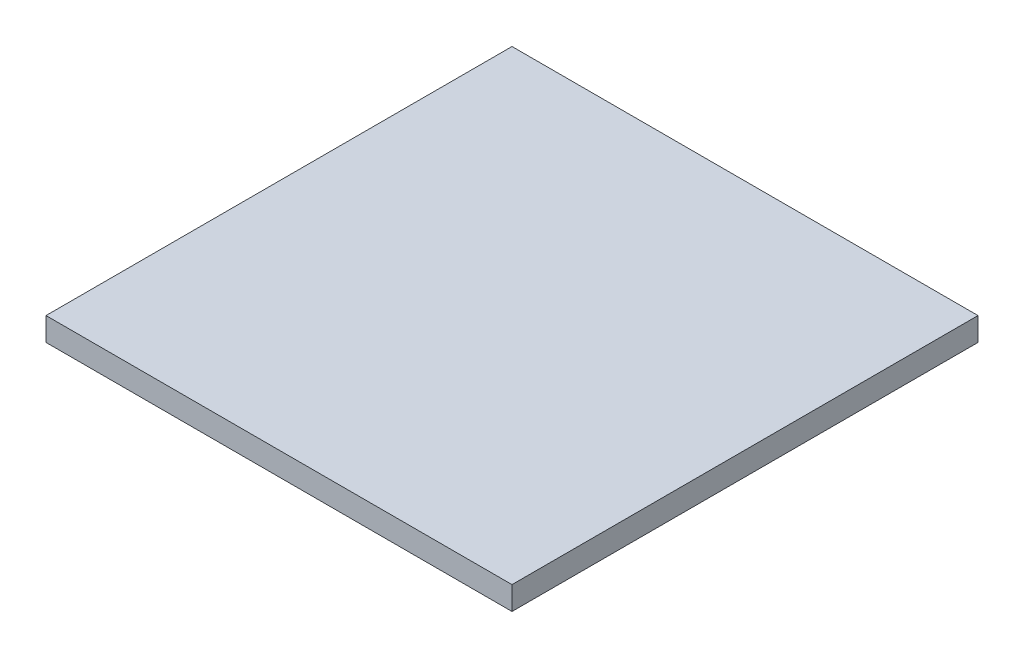
ISO-10303-21;
HEADER;
FILE_DESCRIPTION(('STEP AP214'),'2;1');
FILE_NAME('part.step','',(''),(''),'','','');
FILE_SCHEMA(('AUTOMOTIVE_DESIGN { 1 0 10303 214 1 1 1 1 }'));
ENDSEC;
DATA;
#1=APPLICATION_CONTEXT('core data for automotive mechanical design processes');
#2=APPLICATION_PROTOCOL_DEFINITION('international standard','automotive_design',2000,#1);
#3=PRODUCT_CONTEXT('',#1,'mechanical');
#4=PRODUCT('Part','Part','',(#3));
#5=PRODUCT_RELATED_PRODUCT_CATEGORY('part','',(#4));
#6=PRODUCT_DEFINITION_FORMATION('','',#4);
#7=PRODUCT_DEFINITION_CONTEXT('part definition',#1,'design');
#8=PRODUCT_DEFINITION('design','',#6,#7);
#9=PRODUCT_DEFINITION_SHAPE('','',#8);
#10=(LENGTH_UNIT() NAMED_UNIT(*) SI_UNIT(.MILLI.,.METRE.));
#11=(NAMED_UNIT(*) PLANE_ANGLE_UNIT() SI_UNIT($,.RADIAN.));
#12=(NAMED_UNIT(*) SI_UNIT($,.STERADIAN.) SOLID_ANGLE_UNIT());
#13=UNCERTAINTY_MEASURE_WITH_UNIT(LENGTH_MEASURE(1.E-05),#10,'distance_accuracy_value','');
#14=(GEOMETRIC_REPRESENTATION_CONTEXT(3) GLOBAL_UNCERTAINTY_ASSIGNED_CONTEXT((#13)) GLOBAL_UNIT_ASSIGNED_CONTEXT((#10,
#11,#12)) REPRESENTATION_CONTEXT('',''));
#15=CARTESIAN_POINT('',(0.,0.,0.));
#16=DIRECTION('',(0.,0.,1.));
#17=DIRECTION('',(1.,0.,0.));
#18=AXIS2_PLACEMENT_3D('',#15,#16,#17);
#19=CARTESIAN_POINT('',(0.,2.,0.));
#20=DIRECTION('',(1.,0.,0.));
#21=DIRECTION('',(0.,0.,-1.));
#22=AXIS2_PLACEMENT_3D('',#19,#20,#21);
#23=PLANE('',#22);
#24=DIRECTION('',(0.,0.,1.));
#25=VECTOR('',#24,1.);
#26=CARTESIAN_POINT('',(0.,0.,0.));
#27=LINE('',#26,#25);
#28=CARTESIAN_POINT('',(0.,0.,-40.));
#29=VERTEX_POINT('',#28);
#30=CARTESIAN_POINT('',(0.,0.,0.));
#31=VERTEX_POINT('',#30);
#32=EDGE_CURVE('E102',#29,#31,#27,.T.);
#33=ORIENTED_EDGE('',*,*,#32,.T.);
#34=DIRECTION('',(0.,-1.,0.));
#35=VECTOR('',#34,1.);
#36=CARTESIAN_POINT('',(0.,2.,0.));
#37=LINE('',#36,#35);
#38=CARTESIAN_POINT('',(0.,2.,0.));
#39=VERTEX_POINT('',#38);
#40=EDGE_CURVE('E11',#39,#31,#37,.T.);
#41=ORIENTED_EDGE('',*,*,#40,.F.);
#42=DIRECTION('',(0.,0.,1.));
#43=VECTOR('',#42,1.);
#44=CARTESIAN_POINT('',(0.,2.,0.));
#45=LINE('',#44,#43);
#46=CARTESIAN_POINT('',(0.,2.,-40.));
#47=VERTEX_POINT('',#46);
#48=EDGE_CURVE('E90',#47,#39,#45,.T.);
#49=ORIENTED_EDGE('',*,*,#48,.F.);
#50=DIRECTION('',(0.,-1.,0.));
#51=VECTOR('',#50,1.);
#52=CARTESIAN_POINT('',(0.,2.,-40.));
#53=LINE('',#52,#51);
#54=EDGE_CURVE('E98',#47,#29,#53,.T.);
#55=ORIENTED_EDGE('',*,*,#54,.T.);
#56=EDGE_LOOP('',(#33,#41,#49,#55));
#57=FACE_BOUND('',#56,.T.);
#58=ADVANCED_FACE('F39',(#57),#23,.F.);
#59=CARTESIAN_POINT('',(0.,2.,0.));
#60=DIRECTION('',(0.,0.,-1.));
#61=DIRECTION('',(-1.,0.,0.));
#62=AXIS2_PLACEMENT_3D('',#59,#60,#61);
#63=PLANE('',#62);
#64=DIRECTION('',(1.,0.,0.));
#65=VECTOR('',#64,1.);
#66=CARTESIAN_POINT('',(0.,0.,0.));
#67=LINE('',#66,#65);
#68=CARTESIAN_POINT('',(40.,0.,0.));
#69=VERTEX_POINT('',#68);
#70=EDGE_CURVE('E94',#31,#69,#67,.T.);
#71=ORIENTED_EDGE('',*,*,#70,.T.);
#72=DIRECTION('',(0.,-1.,0.));
#73=VECTOR('',#72,1.);
#74=CARTESIAN_POINT('',(40.,2.,0.));
#75=LINE('',#74,#73);
#76=CARTESIAN_POINT('',(40.,2.,0.));
#77=VERTEX_POINT('',#76);
#78=EDGE_CURVE('E47',#77,#69,#75,.T.);
#79=ORIENTED_EDGE('',*,*,#78,.F.);
#80=DIRECTION('',(1.,0.,0.));
#81=VECTOR('',#80,1.);
#82=CARTESIAN_POINT('',(0.,2.,0.));
#83=LINE('',#82,#81);
#84=EDGE_CURVE('E85',#39,#77,#83,.T.);
#85=ORIENTED_EDGE('',*,*,#84,.F.);
#86=ORIENTED_EDGE('',*,*,#40,.T.);
#87=EDGE_LOOP('',(#71,#79,#85,#86));
#88=FACE_BOUND('',#87,.T.);
#89=ADVANCED_FACE('F93',(#88),#63,.F.);
#90=CARTESIAN_POINT('',(40.,2.,0.));
#91=DIRECTION('',(-1.,0.,0.));
#92=DIRECTION('',(0.,0.,1.));
#93=AXIS2_PLACEMENT_3D('',#90,#91,#92);
#94=PLANE('',#93);
#95=DIRECTION('',(0.,0.,-1.));
#96=VECTOR('',#95,1.);
#97=CARTESIAN_POINT('',(40.,0.,0.));
#98=LINE('',#97,#96);
#99=CARTESIAN_POINT('',(40.,0.,-40.));
#100=VERTEX_POINT('',#99);
#101=EDGE_CURVE('E72',#69,#100,#98,.T.);
#102=ORIENTED_EDGE('',*,*,#101,.T.);
#103=DIRECTION('',(0.,-1.,0.));
#104=VECTOR('',#103,1.);
#105=CARTESIAN_POINT('',(40.,2.,-40.));
#106=LINE('',#105,#104);
#107=CARTESIAN_POINT('',(40.,2.,-40.));
#108=VERTEX_POINT('',#107);
#109=EDGE_CURVE('E95',#108,#100,#106,.T.);
#110=ORIENTED_EDGE('',*,*,#109,.F.);
#111=DIRECTION('',(0.,0.,-1.));
#112=VECTOR('',#111,1.);
#113=CARTESIAN_POINT('',(40.,2.,0.));
#114=LINE('',#113,#112);
#115=EDGE_CURVE('E88',#77,#108,#114,.T.);
#116=ORIENTED_EDGE('',*,*,#115,.F.);
#117=ORIENTED_EDGE('',*,*,#78,.T.);
#118=EDGE_LOOP('',(#102,#110,#116,#117));
#119=FACE_BOUND('',#118,.T.);
#120=ADVANCED_FACE('F96',(#119),#94,.F.);
#121=CARTESIAN_POINT('',(0.,2.,-40.));
#122=DIRECTION('',(0.,0.,1.));
#123=DIRECTION('',(1.,0.,0.));
#124=AXIS2_PLACEMENT_3D('',#121,#122,#123);
#125=PLANE('',#124);
#126=DIRECTION('',(-1.,0.,0.));
#127=VECTOR('',#126,1.);
#128=CARTESIAN_POINT('',(0.,0.,-40.));
#129=LINE('',#128,#127);
#130=EDGE_CURVE('E78',#100,#29,#129,.T.);
#131=ORIENTED_EDGE('',*,*,#130,.T.);
#132=ORIENTED_EDGE('',*,*,#54,.F.);
#133=DIRECTION('',(-1.,0.,0.));
#134=VECTOR('',#133,1.);
#135=CARTESIAN_POINT('',(0.,2.,-40.));
#136=LINE('',#135,#134);
#137=EDGE_CURVE('E55',#108,#47,#136,.T.);
#138=ORIENTED_EDGE('',*,*,#137,.F.);
#139=ORIENTED_EDGE('',*,*,#109,.T.);
#140=EDGE_LOOP('',(#131,#132,#138,#139));
#141=FACE_BOUND('',#140,.T.);
#142=ADVANCED_FACE('F109',(#141),#125,.F.);
#143=CARTESIAN_POINT('',(0.,2.,0.));
#144=DIRECTION('',(0.,-1.,0.));
#145=DIRECTION('',(0.,0.,-1.));
#146=AXIS2_PLACEMENT_3D('',#143,#144,#145);
#147=PLANE('',#146);
#148=ORIENTED_EDGE('',*,*,#48,.T.);
#149=ORIENTED_EDGE('',*,*,#84,.T.);
#150=ORIENTED_EDGE('',*,*,#115,.T.);
#151=ORIENTED_EDGE('',*,*,#137,.T.);
#152=EDGE_LOOP('',(#148,#149,#150,#151));
#153=FACE_BOUND('',#152,.T.);
#154=ADVANCED_FACE('F86',(#153),#147,.F.);
#155=CARTESIAN_POINT('',(0.,0.,0.));
#156=DIRECTION('',(0.,-1.,0.));
#157=DIRECTION('',(0.,0.,-1.));
#158=AXIS2_PLACEMENT_3D('',#155,#156,#157);
#159=PLANE('',#158);
#160=ORIENTED_EDGE('',*,*,#32,.F.);
#161=ORIENTED_EDGE('',*,*,#130,.F.);
#162=ORIENTED_EDGE('',*,*,#101,.F.);
#163=ORIENTED_EDGE('',*,*,#70,.F.);
#164=EDGE_LOOP('',(#160,#161,#162,#163));
#165=FACE_BOUND('',#164,.T.);
#166=ADVANCED_FACE('F112',(#165),#159,.T.);
#167=CLOSED_SHELL('',(#58,#89,#120,#142,#154,#166));
#168=MANIFOLD_SOLID_BREP('B2',#167);
#169=ADVANCED_BREP_SHAPE_REPRESENTATION('',(#18,#168),#14);
#170=SHAPE_DEFINITION_REPRESENTATION(#9,#169);
ENDSEC;
END-ISO-10303-21;
